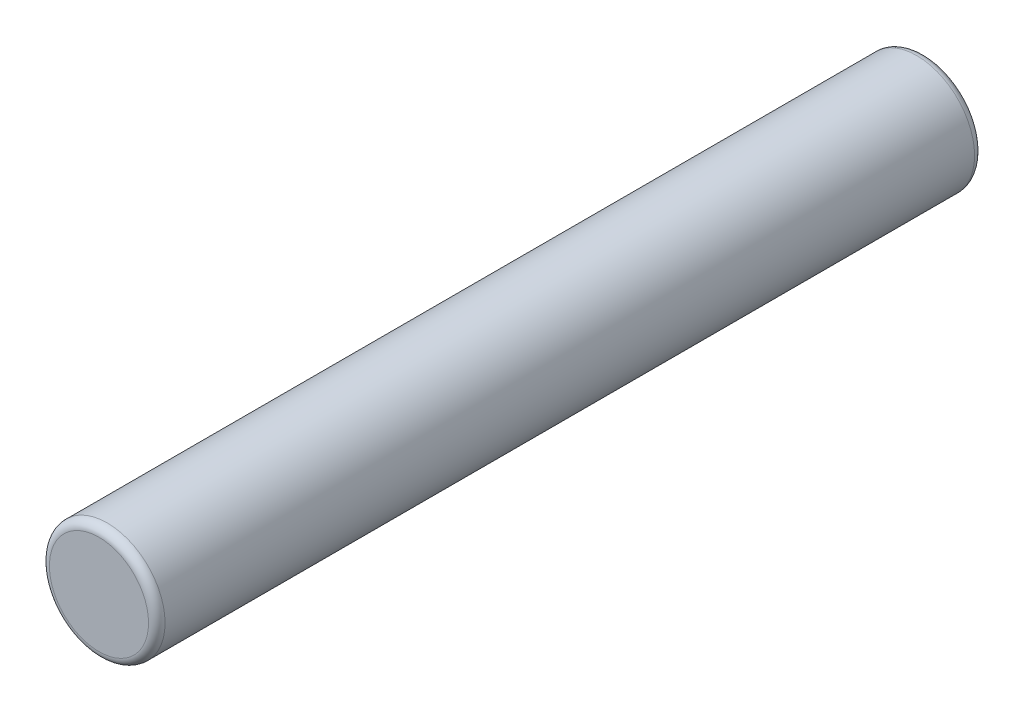
ISO-10303-21;
HEADER;
FILE_DESCRIPTION(('STEP AP214'),'2;1');
FILE_NAME('part.step','',(''),(''),'','','');
FILE_SCHEMA(('AUTOMOTIVE_DESIGN { 1 0 10303 214 1 1 1 1 }'));
ENDSEC;
DATA;
#1=APPLICATION_CONTEXT('core data for automotive mechanical design processes');
#2=APPLICATION_PROTOCOL_DEFINITION('international standard','automotive_design',2000,#1);
#3=PRODUCT_CONTEXT('',#1,'mechanical');
#4=PRODUCT('Part','Part','',(#3));
#5=PRODUCT_RELATED_PRODUCT_CATEGORY('part','',(#4));
#6=PRODUCT_DEFINITION_FORMATION('','',#4);
#7=PRODUCT_DEFINITION_CONTEXT('part definition',#1,'design');
#8=PRODUCT_DEFINITION('design','',#6,#7);
#9=PRODUCT_DEFINITION_SHAPE('','',#8);
#10=(LENGTH_UNIT() NAMED_UNIT(*) SI_UNIT(.MILLI.,.METRE.));
#11=(NAMED_UNIT(*) PLANE_ANGLE_UNIT() SI_UNIT($,.RADIAN.));
#12=(NAMED_UNIT(*) SI_UNIT($,.STERADIAN.) SOLID_ANGLE_UNIT());
#13=UNCERTAINTY_MEASURE_WITH_UNIT(LENGTH_MEASURE(1.E-05),#10,'distance_accuracy_value','');
#14=(GEOMETRIC_REPRESENTATION_CONTEXT(3) GLOBAL_UNCERTAINTY_ASSIGNED_CONTEXT((#13)) GLOBAL_UNIT_ASSIGNED_CONTEXT((#10,
#11,#12)) REPRESENTATION_CONTEXT('',''));
#15=CARTESIAN_POINT('',(0.,0.,0.));
#16=DIRECTION('',(0.,0.,1.));
#17=DIRECTION('',(1.,0.,0.));
#18=AXIS2_PLACEMENT_3D('',#15,#16,#17);
#19=CARTESIAN_POINT('',(0.,0.,39.6875));
#20=DIRECTION('',(0.,0.,-1.));
#21=DIRECTION('',(-1.,0.,0.));
#22=AXIS2_PLACEMENT_3D('',#19,#20,#21);
#23=CYLINDRICAL_SURFACE('',#22,5.55625);
#24=CARTESIAN_POINT('',(0.,0.,38.89375));
#25=DIRECTION('',(0.,0.,1.));
#26=DIRECTION('',(1.,0.,0.));
#27=AXIS2_PLACEMENT_3D('',#24,#25,#26);
#28=CIRCLE('',#27,5.55625);
#29=CARTESIAN_POINT('',(-5.55625,0.,38.89375));
#30=VERTEX_POINT('',#29);
#31=EDGE_CURVE('E42',#30,#30,#28,.F.);
#32=CARTESIAN_POINT('',(0.,0.,-38.89375));
#33=DIRECTION('',(0.,0.,1.));
#34=DIRECTION('',(1.,0.,0.));
#35=AXIS2_PLACEMENT_3D('',#32,#33,#34);
#36=CIRCLE('',#35,5.55625);
#37=CARTESIAN_POINT('',(-5.55625,0.,-38.89375));
#38=VERTEX_POINT('',#37);
#39=EDGE_CURVE('E46',#38,#38,#36,.T.);
#40=CARTESIAN_POINT('',(-5.55625,0.,38.89375));
#41=CARTESIAN_POINT('',(-5.55625,0.,38.0834635416667));
#42=CARTESIAN_POINT('',(-5.55625,0.,37.2731770833333));
#43=CARTESIAN_POINT('',(-5.55625,0.,35.6526041666667));
#44=CARTESIAN_POINT('',(-5.55625,0.,34.8423177083333));
#45=CARTESIAN_POINT('',(-5.55625,0.,33.2217447916667));
#46=CARTESIAN_POINT('',(-5.55625,0.,32.4114583333333));
#47=CARTESIAN_POINT('',(-5.55625,0.,30.7908854166667));
#48=CARTESIAN_POINT('',(-5.55625,0.,29.9805989583333));
#49=CARTESIAN_POINT('',(-5.55625,0.,28.3600260416667));
#50=CARTESIAN_POINT('',(-5.55625,0.,27.5497395833333));
#51=CARTESIAN_POINT('',(-5.55625,0.,25.9291666666667));
#52=CARTESIAN_POINT('',(-5.55625,0.,25.1188802083333));
#53=CARTESIAN_POINT('',(-5.55625,0.,23.4983072916667));
#54=CARTESIAN_POINT('',(-5.55625,0.,22.6880208333333));
#55=CARTESIAN_POINT('',(-5.55625,0.,21.0674479166667));
#56=CARTESIAN_POINT('',(-5.55625,0.,20.2571614583333));
#57=CARTESIAN_POINT('',(-5.55625,0.,18.6365885416667));
#58=CARTESIAN_POINT('',(-5.55625,0.,17.8263020833333));
#59=CARTESIAN_POINT('',(-5.55625,0.,16.2057291666667));
#60=CARTESIAN_POINT('',(-5.55625,0.,15.3954427083333));
#61=CARTESIAN_POINT('',(-5.55625,0.,13.7748697916667));
#62=CARTESIAN_POINT('',(-5.55625,0.,12.9645833333333));
#63=CARTESIAN_POINT('',(-5.55625,0.,11.3440104166667));
#64=CARTESIAN_POINT('',(-5.55625,0.,10.5337239583333));
#65=CARTESIAN_POINT('',(-5.55625,0.,8.91315104166666));
#66=CARTESIAN_POINT('',(-5.55625,0.,8.10286458333333));
#67=CARTESIAN_POINT('',(-5.55625,0.,6.48229166666667));
#68=CARTESIAN_POINT('',(-5.55625,0.,5.67200520833333));
#69=CARTESIAN_POINT('',(-5.55625,0.,4.05143229166666));
#70=CARTESIAN_POINT('',(-5.55625,0.,3.24114583333333));
#71=CARTESIAN_POINT('',(-5.55625,0.,1.62057291666666));
#72=CARTESIAN_POINT('',(-5.55625,0.,0.810286458333325));
#73=CARTESIAN_POINT('',(-5.55625,0.,-0.810286458333339));
#74=CARTESIAN_POINT('',(-5.55625,0.,-1.62057291666667));
#75=CARTESIAN_POINT('',(-5.55625,0.,-3.24114583333334));
#76=CARTESIAN_POINT('',(-5.55625,0.,-4.05143229166667));
#77=CARTESIAN_POINT('',(-5.55625,0.,-5.67200520833334));
#78=CARTESIAN_POINT('',(-5.55625,0.,-6.48229166666667));
#79=CARTESIAN_POINT('',(-5.55625,0.,-8.10286458333334));
#80=CARTESIAN_POINT('',(-5.55625,0.,-8.91315104166668));
#81=CARTESIAN_POINT('',(-5.55625,0.,-10.5337239583333));
#82=CARTESIAN_POINT('',(-5.55625,0.,-11.3440104166667));
#83=CARTESIAN_POINT('',(-5.55625,0.,-12.9645833333333));
#84=CARTESIAN_POINT('',(-5.55625,0.,-13.7748697916667));
#85=CARTESIAN_POINT('',(-5.55625,0.,-15.3954427083333));
#86=CARTESIAN_POINT('',(-5.55625,0.,-16.2057291666667));
#87=CARTESIAN_POINT('',(-5.55625,0.,-17.8263020833333));
#88=CARTESIAN_POINT('',(-5.55625,0.,-18.6365885416667));
#89=CARTESIAN_POINT('',(-5.55625,0.,-20.2571614583333));
#90=CARTESIAN_POINT('',(-5.55625,0.,-21.0674479166667));
#91=CARTESIAN_POINT('',(-5.55625,0.,-22.6880208333333));
#92=CARTESIAN_POINT('',(-5.55625,0.,-23.4983072916667));
#93=CARTESIAN_POINT('',(-5.55625,0.,-25.1188802083333));
#94=CARTESIAN_POINT('',(-5.55625,0.,-25.9291666666667));
#95=CARTESIAN_POINT('',(-5.55625,0.,-27.5497395833333));
#96=CARTESIAN_POINT('',(-5.55625,0.,-28.3600260416667));
#97=CARTESIAN_POINT('',(-5.55625,0.,-29.9805989583333));
#98=CARTESIAN_POINT('',(-5.55625,0.,-30.7908854166667));
#99=CARTESIAN_POINT('',(-5.55625,0.,-32.4114583333333));
#100=CARTESIAN_POINT('',(-5.55625,0.,-33.2217447916667));
#101=CARTESIAN_POINT('',(-5.55625,0.,-34.8423177083333));
#102=CARTESIAN_POINT('',(-5.55625,0.,-35.6526041666667));
#103=CARTESIAN_POINT('',(-5.55625,0.,-37.2731770833333));
#104=CARTESIAN_POINT('',(-5.55625,0.,-38.0834635416667));
#105=CARTESIAN_POINT('',(-5.55625,0.,-38.89375));
#106=B_SPLINE_CURVE_WITH_KNOTS('',3,(#40,#41,#42,#43,#44,#45,#46,#47,#48,#49,#50,#51,#52,#53,
#54,#55,#56,#57,#58,#59,#60,#61,#62,#63,#64,#65,#66,#67,#68,#69,#70,#71,#72,#73,#74,#75,#76,#77,
#78,#79,#80,#81,#82,#83,#84,#85,#86,#87,#88,#89,#90,#91,#92,#93,#94,#95,#96,#97,#98,#99,#100,
#101,#102,#103,#104,#105),.UNSPECIFIED.,.F.,.F.,(4,2,2,2,2,2,2,2,2,2,2,2,2,2,2,2,2,2,2,2,2,2,2,
2,2,2,2,2,2,2,2,2,4),(0.,2.430859375,4.86171875,7.292578125,9.7234375,12.154296875,14.58515625,
17.016015625,19.446875,21.877734375,24.30859375,26.739453125,29.1703125,31.601171875,
34.03203125,36.462890625,38.89375,41.324609375,43.75546875,46.186328125,48.6171875,51.048046875,
53.47890625,55.909765625,58.340625,60.771484375,63.20234375,65.633203125,68.0640625,
70.494921875,72.92578125,75.356640625,77.7875),.UNSPECIFIED.);
#107=EDGE_CURVE('BSEAM35',#30,#38,#106,.T.);
#108=ORIENTED_EDGE('',*,*,#31,.T.);
#109=ORIENTED_EDGE('',*,*,#39,.T.);
#110=ORIENTED_EDGE('',*,*,#107,.T.);
#111=ORIENTED_EDGE('',*,*,#107,.F.);
#112=EDGE_LOOP('',(#108,#110,#109,#111));
#113=FACE_BOUND('',#112,.T.);
#114=ADVANCED_FACE('F35',(#113),#23,.T.);
#115=CARTESIAN_POINT('',(0.,0.,39.6875));
#116=DIRECTION('',(0.,0.,1.));
#117=DIRECTION('',(1.,0.,0.));
#118=AXIS2_PLACEMENT_3D('',#115,#116,#117);
#119=PLANE('',#118);
#120=CARTESIAN_POINT('',(0.,0.,39.6875));
#121=DIRECTION('',(0.,0.,1.));
#122=DIRECTION('',(1.,0.,0.));
#123=AXIS2_PLACEMENT_3D('',#120,#121,#122);
#124=CIRCLE('',#123,4.7625);
#125=CARTESIAN_POINT('',(4.7625,0.,39.6875));
#126=VERTEX_POINT('',#125);
#127=EDGE_CURVE('E50',#126,#126,#124,.T.);
#128=ORIENTED_EDGE('',*,*,#127,.T.);
#129=EDGE_LOOP('',(#128));
#130=FACE_BOUND('',#129,.T.);
#131=ADVANCED_FACE('F56',(#130),#119,.T.);
#132=CARTESIAN_POINT('',(0.,0.,-39.6875));
#133=DIRECTION('',(0.,0.,1.));
#134=DIRECTION('',(1.,0.,0.));
#135=AXIS2_PLACEMENT_3D('',#132,#133,#134);
#136=PLANE('',#135);
#137=CARTESIAN_POINT('',(0.,0.,-39.6875));
#138=DIRECTION('',(0.,0.,1.));
#139=DIRECTION('',(1.,0.,0.));
#140=AXIS2_PLACEMENT_3D('',#137,#138,#139);
#141=CIRCLE('',#140,4.7625);
#142=CARTESIAN_POINT('',(4.7625,0.,-39.6875));
#143=VERTEX_POINT('',#142);
#144=EDGE_CURVE('E10',#143,#143,#141,.F.);
#145=ORIENTED_EDGE('',*,*,#144,.T.);
#146=EDGE_LOOP('',(#145));
#147=FACE_BOUND('',#146,.T.);
#148=ADVANCED_FACE('F60',(#147),#136,.F.);
#149=CARTESIAN_POINT('',(0.,0.,38.89375));
#150=DIRECTION('',(0.,0.,1.));
#151=DIRECTION('',(1.,0.,0.));
#152=AXIS2_PLACEMENT_3D('',#149,#150,#151);
#153=TOROIDAL_SURFACE('',#152,4.7625,0.79375);
#154=ORIENTED_EDGE('',*,*,#31,.F.);
#155=EDGE_LOOP('',(#154));
#156=FACE_BOUND('',#155,.T.);
#157=ORIENTED_EDGE('',*,*,#127,.F.);
#158=EDGE_LOOP('',(#157));
#159=FACE_BOUND('',#158,.T.);
#160=ADVANCED_FACE('F58',(#156,#159),#153,.T.);
#161=CARTESIAN_POINT('',(0.,0.,-38.89375));
#162=DIRECTION('',(0.,0.,1.));
#163=DIRECTION('',(1.,0.,0.));
#164=AXIS2_PLACEMENT_3D('',#161,#162,#163);
#165=TOROIDAL_SURFACE('',#164,4.7625,0.79375);
#166=ORIENTED_EDGE('',*,*,#144,.F.);
#167=EDGE_LOOP('',(#166));
#168=FACE_BOUND('',#167,.T.);
#169=ORIENTED_EDGE('',*,*,#39,.F.);
#170=EDGE_LOOP('',(#169));
#171=FACE_BOUND('',#170,.T.);
#172=ADVANCED_FACE('F37',(#168,#171),#165,.T.);
#173=CLOSED_SHELL('',(#114,#131,#148,#160,#172));
#174=MANIFOLD_SOLID_BREP('B2',#173);
#175=ADVANCED_BREP_SHAPE_REPRESENTATION('',(#18,#174),#14);
#176=SHAPE_DEFINITION_REPRESENTATION(#9,#175);
ENDSEC;
END-ISO-10303-21;
